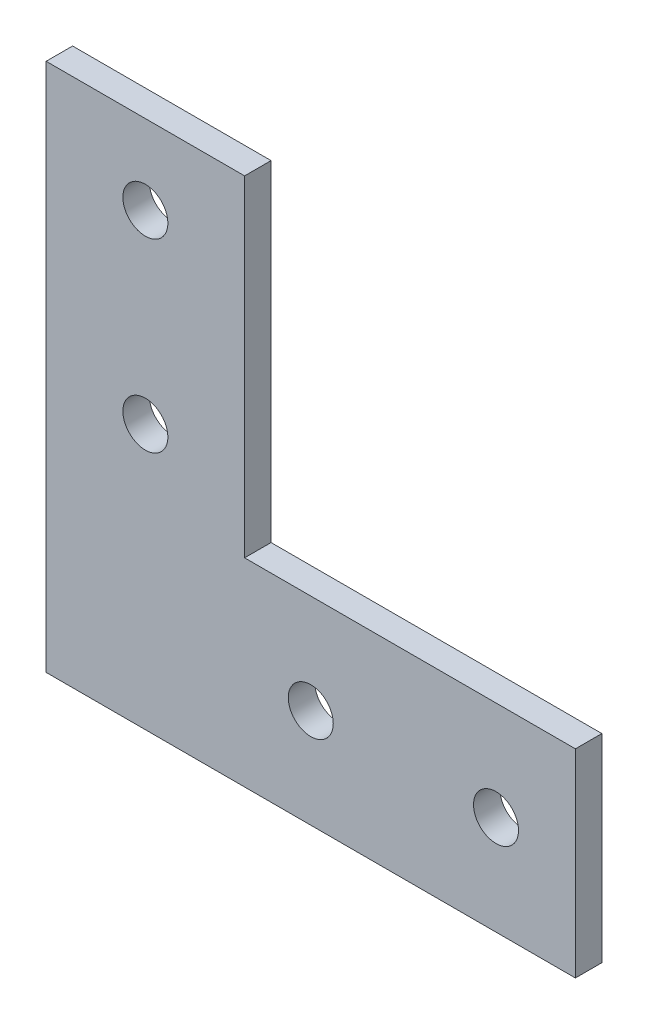
ISO-10303-21;
HEADER;
FILE_DESCRIPTION(('STEP AP214'),'2;1');
FILE_NAME('part.step','',(''),(''),'','','');
FILE_SCHEMA(('AUTOMOTIVE_DESIGN { 1 0 10303 214 1 1 1 1 }'));
ENDSEC;
DATA;
#1=APPLICATION_CONTEXT('core data for automotive mechanical design processes');
#2=APPLICATION_PROTOCOL_DEFINITION('international standard','automotive_design',2000,#1);
#3=PRODUCT_CONTEXT('',#1,'mechanical');
#4=PRODUCT('Part','Part','',(#3));
#5=PRODUCT_RELATED_PRODUCT_CATEGORY('part','',(#4));
#6=PRODUCT_DEFINITION_FORMATION('','',#4);
#7=PRODUCT_DEFINITION_CONTEXT('part definition',#1,'design');
#8=PRODUCT_DEFINITION('design','',#6,#7);
#9=PRODUCT_DEFINITION_SHAPE('','',#8);
#10=(LENGTH_UNIT() NAMED_UNIT(*) SI_UNIT(.MILLI.,.METRE.));
#11=(NAMED_UNIT(*) PLANE_ANGLE_UNIT() SI_UNIT($,.RADIAN.));
#12=(NAMED_UNIT(*) SI_UNIT($,.STERADIAN.) SOLID_ANGLE_UNIT());
#13=UNCERTAINTY_MEASURE_WITH_UNIT(LENGTH_MEASURE(1.E-05),#10,'distance_accuracy_value','');
#14=(GEOMETRIC_REPRESENTATION_CONTEXT(3) GLOBAL_UNCERTAINTY_ASSIGNED_CONTEXT((#13)) GLOBAL_UNIT_ASSIGNED_CONTEXT((#10,
#11,#12)) REPRESENTATION_CONTEXT('',''));
#15=CARTESIAN_POINT('',(0.,0.,0.));
#16=DIRECTION('',(0.,0.,1.));
#17=DIRECTION('',(1.,0.,0.));
#18=AXIS2_PLACEMENT_3D('',#15,#16,#17);
#19=CARTESIAN_POINT('',(0.,0.,2.));
#20=DIRECTION('',(0.,0.,1.));
#21=DIRECTION('',(1.,0.,0.));
#22=AXIS2_PLACEMENT_3D('',#19,#20,#21);
#23=PLANE('',#22);
#24=CARTESIAN_POINT('',(7.50000000000002,34.,2.));
#25=DIRECTION('',(0.,0.,1.));
#26=DIRECTION('',(-1.,0.,0.));
#27=AXIS2_PLACEMENT_3D('',#24,#25,#26);
#28=CIRCLE('',#27,1.7);
#29=CARTESIAN_POINT('',(5.80000000000002,34.,2.));
#30=VERTEX_POINT('',#29);
#31=EDGE_CURVE('E215',#30,#30,#28,.T.);
#32=ORIENTED_EDGE('',*,*,#31,.F.);
#33=EDGE_LOOP('',(#32));
#34=FACE_BOUND('',#33,.T.);
#35=CARTESIAN_POINT('',(20.,7.5,2.));
#36=DIRECTION('',(0.,0.,1.));
#37=DIRECTION('',(1.,0.,0.));
#38=AXIS2_PLACEMENT_3D('',#35,#36,#37);
#39=CIRCLE('',#38,1.7);
#40=CARTESIAN_POINT('',(21.7,7.5,2.));
#41=VERTEX_POINT('',#40);
#42=EDGE_CURVE('E137',#41,#41,#39,.T.);
#43=ORIENTED_EDGE('',*,*,#42,.F.);
#44=EDGE_LOOP('',(#43));
#45=FACE_BOUND('',#44,.T.);
#46=DIRECTION('',(0.,-1.,0.));
#47=VECTOR('',#46,1.);
#48=CARTESIAN_POINT('',(0.,40.,2.));
#49=LINE('',#48,#47);
#50=CARTESIAN_POINT('',(0.,40.,2.));
#51=VERTEX_POINT('',#50);
#52=CARTESIAN_POINT('',(0.,0.,2.));
#53=VERTEX_POINT('',#52);
#54=EDGE_CURVE('E149',#51,#53,#49,.T.);
#55=ORIENTED_EDGE('',*,*,#54,.T.);
#56=DIRECTION('',(1.,0.,0.));
#57=VECTOR('',#56,1.);
#58=CARTESIAN_POINT('',(0.,0.,2.));
#59=LINE('',#58,#57);
#60=CARTESIAN_POINT('',(40.,0.,2.));
#61=VERTEX_POINT('',#60);
#62=EDGE_CURVE('E97',#53,#61,#59,.T.);
#63=ORIENTED_EDGE('',*,*,#62,.T.);
#64=DIRECTION('',(0.,1.,0.));
#65=VECTOR('',#64,1.);
#66=CARTESIAN_POINT('',(40.,0.,2.));
#67=LINE('',#66,#65);
#68=CARTESIAN_POINT('',(40.,15.,2.));
#69=VERTEX_POINT('',#68);
#70=EDGE_CURVE('E110',#61,#69,#67,.T.);
#71=ORIENTED_EDGE('',*,*,#70,.T.);
#72=DIRECTION('',(-1.,0.,0.));
#73=VECTOR('',#72,1.);
#74=CARTESIAN_POINT('',(40.,15.,2.));
#75=LINE('',#74,#73);
#76=CARTESIAN_POINT('',(15.,15.,2.));
#77=VERTEX_POINT('',#76);
#78=EDGE_CURVE('E104',#69,#77,#75,.T.);
#79=ORIENTED_EDGE('',*,*,#78,.T.);
#80=DIRECTION('',(0.,1.,0.));
#81=VECTOR('',#80,1.);
#82=CARTESIAN_POINT('',(15.,15.,2.));
#83=LINE('',#82,#81);
#84=CARTESIAN_POINT('',(15.,40.,2.));
#85=VERTEX_POINT('',#84);
#86=EDGE_CURVE('E108',#77,#85,#83,.T.);
#87=ORIENTED_EDGE('',*,*,#86,.T.);
#88=DIRECTION('',(-1.,0.,0.));
#89=VECTOR('',#88,1.);
#90=CARTESIAN_POINT('',(15.,40.,2.));
#91=LINE('',#90,#89);
#92=EDGE_CURVE('E60',#85,#51,#91,.T.);
#93=ORIENTED_EDGE('',*,*,#92,.T.);
#94=EDGE_LOOP('',(#55,#63,#71,#79,#87,#93));
#95=FACE_BOUND('',#94,.T.);
#96=CARTESIAN_POINT('',(34.,7.5,2.));
#97=DIRECTION('',(0.,0.,1.));
#98=DIRECTION('',(1.,0.,0.));
#99=AXIS2_PLACEMENT_3D('',#96,#97,#98);
#100=CIRCLE('',#99,1.7);
#101=CARTESIAN_POINT('',(35.7,7.5,2.));
#102=VERTEX_POINT('',#101);
#103=EDGE_CURVE('E223',#102,#102,#100,.T.);
#104=ORIENTED_EDGE('',*,*,#103,.F.);
#105=EDGE_LOOP('',(#104));
#106=FACE_BOUND('',#105,.T.);
#107=CARTESIAN_POINT('',(7.5,20.,2.));
#108=DIRECTION('',(0.,0.,1.));
#109=DIRECTION('',(-1.,0.,0.));
#110=AXIS2_PLACEMENT_3D('',#107,#108,#109);
#111=CIRCLE('',#110,1.7);
#112=CARTESIAN_POINT('',(5.8,20.,2.));
#113=VERTEX_POINT('',#112);
#114=EDGE_CURVE('E204',#113,#113,#111,.T.);
#115=ORIENTED_EDGE('',*,*,#114,.F.);
#116=EDGE_LOOP('',(#115));
#117=FACE_BOUND('',#116,.T.);
#118=ADVANCED_FACE('F42',(#34,#45,#95,#106,#117),#23,.T.);
#119=CARTESIAN_POINT('',(0.,0.,0.));
#120=DIRECTION('',(0.,0.,1.));
#121=DIRECTION('',(1.,0.,0.));
#122=AXIS2_PLACEMENT_3D('',#119,#120,#121);
#123=PLANE('',#122);
#124=DIRECTION('',(0.,-1.,0.));
#125=VECTOR('',#124,1.);
#126=CARTESIAN_POINT('',(0.,40.,0.));
#127=LINE('',#126,#125);
#128=CARTESIAN_POINT('',(0.,40.,0.));
#129=VERTEX_POINT('',#128);
#130=CARTESIAN_POINT('',(0.,0.,0.));
#131=VERTEX_POINT('',#130);
#132=EDGE_CURVE('E132',#129,#131,#127,.T.);
#133=ORIENTED_EDGE('',*,*,#132,.F.);
#134=DIRECTION('',(-1.,0.,0.));
#135=VECTOR('',#134,1.);
#136=CARTESIAN_POINT('',(15.,40.,0.));
#137=LINE('',#136,#135);
#138=CARTESIAN_POINT('',(15.,40.,0.));
#139=VERTEX_POINT('',#138);
#140=EDGE_CURVE('E89',#139,#129,#137,.T.);
#141=ORIENTED_EDGE('',*,*,#140,.F.);
#142=DIRECTION('',(0.,1.,0.));
#143=VECTOR('',#142,1.);
#144=CARTESIAN_POINT('',(15.,15.,0.));
#145=LINE('',#144,#143);
#146=CARTESIAN_POINT('',(15.,15.,0.));
#147=VERTEX_POINT('',#146);
#148=EDGE_CURVE('E83',#147,#139,#145,.T.);
#149=ORIENTED_EDGE('',*,*,#148,.F.);
#150=DIRECTION('',(-1.,0.,0.));
#151=VECTOR('',#150,1.);
#152=CARTESIAN_POINT('',(40.,15.,0.));
#153=LINE('',#152,#151);
#154=CARTESIAN_POINT('',(40.,15.,0.));
#155=VERTEX_POINT('',#154);
#156=EDGE_CURVE('E119',#155,#147,#153,.T.);
#157=ORIENTED_EDGE('',*,*,#156,.F.);
#158=DIRECTION('',(0.,1.,0.));
#159=VECTOR('',#158,1.);
#160=CARTESIAN_POINT('',(40.,0.,0.));
#161=LINE('',#160,#159);
#162=CARTESIAN_POINT('',(40.,0.,0.));
#163=VERTEX_POINT('',#162);
#164=EDGE_CURVE('E140',#163,#155,#161,.T.);
#165=ORIENTED_EDGE('',*,*,#164,.F.);
#166=DIRECTION('',(1.,0.,0.));
#167=VECTOR('',#166,1.);
#168=CARTESIAN_POINT('',(0.,0.,0.));
#169=LINE('',#168,#167);
#170=EDGE_CURVE('E136',#131,#163,#169,.T.);
#171=ORIENTED_EDGE('',*,*,#170,.F.);
#172=EDGE_LOOP('',(#133,#141,#149,#157,#165,#171));
#173=FACE_BOUND('',#172,.T.);
#174=CARTESIAN_POINT('',(20.,7.5,0.));
#175=DIRECTION('',(0.,0.,1.));
#176=DIRECTION('',(1.,0.,0.));
#177=AXIS2_PLACEMENT_3D('',#174,#175,#176);
#178=CIRCLE('',#177,1.7);
#179=CARTESIAN_POINT('',(21.7,7.5,0.));
#180=VERTEX_POINT('',#179);
#181=EDGE_CURVE('E227',#180,#180,#178,.T.);
#182=ORIENTED_EDGE('',*,*,#181,.T.);
#183=EDGE_LOOP('',(#182));
#184=FACE_BOUND('',#183,.T.);
#185=CARTESIAN_POINT('',(34.,7.5,0.));
#186=DIRECTION('',(0.,0.,1.));
#187=DIRECTION('',(1.,0.,0.));
#188=AXIS2_PLACEMENT_3D('',#185,#186,#187);
#189=CIRCLE('',#188,1.7);
#190=CARTESIAN_POINT('',(35.7,7.5,0.));
#191=VERTEX_POINT('',#190);
#192=EDGE_CURVE('E219',#191,#191,#189,.T.);
#193=ORIENTED_EDGE('',*,*,#192,.T.);
#194=EDGE_LOOP('',(#193));
#195=FACE_BOUND('',#194,.T.);
#196=CARTESIAN_POINT('',(7.50000000000002,34.,0.));
#197=DIRECTION('',(0.,0.,1.));
#198=DIRECTION('',(-1.,0.,0.));
#199=AXIS2_PLACEMENT_3D('',#196,#197,#198);
#200=CIRCLE('',#199,1.7);
#201=CARTESIAN_POINT('',(5.80000000000002,34.,0.));
#202=VERTEX_POINT('',#201);
#203=EDGE_CURVE('E212',#202,#202,#200,.T.);
#204=ORIENTED_EDGE('',*,*,#203,.T.);
#205=EDGE_LOOP('',(#204));
#206=FACE_BOUND('',#205,.T.);
#207=CARTESIAN_POINT('',(7.5,20.,0.));
#208=DIRECTION('',(0.,0.,1.));
#209=DIRECTION('',(-1.,0.,0.));
#210=AXIS2_PLACEMENT_3D('',#207,#208,#209);
#211=CIRCLE('',#210,1.7);
#212=CARTESIAN_POINT('',(5.8,20.,0.));
#213=VERTEX_POINT('',#212);
#214=EDGE_CURVE('E207',#213,#213,#211,.T.);
#215=ORIENTED_EDGE('',*,*,#214,.T.);
#216=EDGE_LOOP('',(#215));
#217=FACE_BOUND('',#216,.T.);
#218=ADVANCED_FACE('F162',(#173,#184,#195,#206,#217),#123,.F.);
#219=CARTESIAN_POINT('',(0.,40.,2.));
#220=DIRECTION('',(1.,0.,0.));
#221=DIRECTION('',(0.,1.,0.));
#222=AXIS2_PLACEMENT_3D('',#219,#220,#221);
#223=PLANE('',#222);
#224=ORIENTED_EDGE('',*,*,#132,.T.);
#225=DIRECTION('',(0.,0.,-1.));
#226=VECTOR('',#225,1.);
#227=CARTESIAN_POINT('',(0.,0.,2.));
#228=LINE('',#227,#226);
#229=EDGE_CURVE('E11',#53,#131,#228,.T.);
#230=ORIENTED_EDGE('',*,*,#229,.F.);
#231=ORIENTED_EDGE('',*,*,#54,.F.);
#232=DIRECTION('',(0.,0.,-1.));
#233=VECTOR('',#232,1.);
#234=CARTESIAN_POINT('',(0.,40.,2.));
#235=LINE('',#234,#233);
#236=EDGE_CURVE('E128',#51,#129,#235,.T.);
#237=ORIENTED_EDGE('',*,*,#236,.T.);
#238=EDGE_LOOP('',(#224,#230,#231,#237));
#239=FACE_BOUND('',#238,.T.);
#240=ADVANCED_FACE('F44',(#239),#223,.F.);
#241=CARTESIAN_POINT('',(0.,0.,2.));
#242=DIRECTION('',(0.,1.,0.));
#243=DIRECTION('',(0.,0.,1.));
#244=AXIS2_PLACEMENT_3D('',#241,#242,#243);
#245=PLANE('',#244);
#246=ORIENTED_EDGE('',*,*,#170,.T.);
#247=DIRECTION('',(0.,0.,-1.));
#248=VECTOR('',#247,1.);
#249=CARTESIAN_POINT('',(40.,0.,2.));
#250=LINE('',#249,#248);
#251=EDGE_CURVE('E52',#61,#163,#250,.T.);
#252=ORIENTED_EDGE('',*,*,#251,.F.);
#253=ORIENTED_EDGE('',*,*,#62,.F.);
#254=ORIENTED_EDGE('',*,*,#229,.T.);
#255=EDGE_LOOP('',(#246,#252,#253,#254));
#256=FACE_BOUND('',#255,.T.);
#257=ADVANCED_FACE('F295',(#256),#245,.F.);
#258=CARTESIAN_POINT('',(40.,0.,2.));
#259=DIRECTION('',(-1.,0.,0.));
#260=DIRECTION('',(0.,-1.,0.));
#261=AXIS2_PLACEMENT_3D('',#258,#259,#260);
#262=PLANE('',#261);
#263=ORIENTED_EDGE('',*,*,#164,.T.);
#264=DIRECTION('',(0.,0.,-1.));
#265=VECTOR('',#264,1.);
#266=CARTESIAN_POINT('',(40.,15.,2.));
#267=LINE('',#266,#265);
#268=EDGE_CURVE('E121',#69,#155,#267,.T.);
#269=ORIENTED_EDGE('',*,*,#268,.F.);
#270=ORIENTED_EDGE('',*,*,#70,.F.);
#271=ORIENTED_EDGE('',*,*,#251,.T.);
#272=EDGE_LOOP('',(#263,#269,#270,#271));
#273=FACE_BOUND('',#272,.T.);
#274=ADVANCED_FACE('F159',(#273),#262,.F.);
#275=CARTESIAN_POINT('',(40.,15.,2.));
#276=DIRECTION('',(0.,-1.,0.));
#277=DIRECTION('',(1.,0.,0.));
#278=AXIS2_PLACEMENT_3D('',#275,#276,#277);
#279=PLANE('',#278);
#280=ORIENTED_EDGE('',*,*,#156,.T.);
#281=DIRECTION('',(0.,0.,-1.));
#282=VECTOR('',#281,1.);
#283=CARTESIAN_POINT('',(15.,15.,2.));
#284=LINE('',#283,#282);
#285=EDGE_CURVE('E116',#77,#147,#284,.T.);
#286=ORIENTED_EDGE('',*,*,#285,.F.);
#287=ORIENTED_EDGE('',*,*,#78,.F.);
#288=ORIENTED_EDGE('',*,*,#268,.T.);
#289=EDGE_LOOP('',(#280,#286,#287,#288));
#290=FACE_BOUND('',#289,.T.);
#291=ADVANCED_FACE('F117',(#290),#279,.F.);
#292=CARTESIAN_POINT('',(15.,15.,2.));
#293=DIRECTION('',(-1.,0.,0.));
#294=DIRECTION('',(0.,0.,1.));
#295=AXIS2_PLACEMENT_3D('',#292,#293,#294);
#296=PLANE('',#295);
#297=ORIENTED_EDGE('',*,*,#148,.T.);
#298=DIRECTION('',(0.,0.,-1.));
#299=VECTOR('',#298,1.);
#300=CARTESIAN_POINT('',(15.,40.,2.));
#301=LINE('',#300,#299);
#302=EDGE_CURVE('E122',#85,#139,#301,.T.);
#303=ORIENTED_EDGE('',*,*,#302,.F.);
#304=ORIENTED_EDGE('',*,*,#86,.F.);
#305=ORIENTED_EDGE('',*,*,#285,.T.);
#306=EDGE_LOOP('',(#297,#303,#304,#305));
#307=FACE_BOUND('',#306,.T.);
#308=ADVANCED_FACE('F124',(#307),#296,.F.);
#309=CARTESIAN_POINT('',(15.,40.,2.));
#310=DIRECTION('',(0.,-1.,0.));
#311=DIRECTION('',(0.,0.,-1.));
#312=AXIS2_PLACEMENT_3D('',#309,#310,#311);
#313=PLANE('',#312);
#314=ORIENTED_EDGE('',*,*,#140,.T.);
#315=ORIENTED_EDGE('',*,*,#236,.F.);
#316=ORIENTED_EDGE('',*,*,#92,.F.);
#317=ORIENTED_EDGE('',*,*,#302,.T.);
#318=EDGE_LOOP('',(#314,#315,#316,#317));
#319=FACE_BOUND('',#318,.T.);
#320=ADVANCED_FACE('F167',(#319),#313,.F.);
#321=CARTESIAN_POINT('',(20.,7.5,2.));
#322=DIRECTION('',(0.,0.,-1.));
#323=DIRECTION('',(-1.,0.,0.));
#324=AXIS2_PLACEMENT_3D('',#321,#322,#323);
#325=CYLINDRICAL_SURFACE('',#324,1.7);
#326=ORIENTED_EDGE('',*,*,#42,.T.);
#327=EDGE_LOOP('',(#326));
#328=FACE_BOUND('',#327,.T.);
#329=ORIENTED_EDGE('',*,*,#181,.F.);
#330=EDGE_LOOP('',(#329));
#331=FACE_BOUND('',#330,.T.);
#332=ADVANCED_FACE('F169',(#328,#331),#325,.F.);
#333=CARTESIAN_POINT('',(34.,7.5,2.));
#334=DIRECTION('',(0.,0.,-1.));
#335=DIRECTION('',(-1.,0.,0.));
#336=AXIS2_PLACEMENT_3D('',#333,#334,#335);
#337=CYLINDRICAL_SURFACE('',#336,1.7);
#338=ORIENTED_EDGE('',*,*,#103,.T.);
#339=EDGE_LOOP('',(#338));
#340=FACE_BOUND('',#339,.T.);
#341=ORIENTED_EDGE('',*,*,#192,.F.);
#342=EDGE_LOOP('',(#341));
#343=FACE_BOUND('',#342,.T.);
#344=ADVANCED_FACE('F175',(#340,#343),#337,.F.);
#345=CARTESIAN_POINT('',(7.50000000000002,34.,2.));
#346=DIRECTION('',(0.,0.,-1.));
#347=DIRECTION('',(-1.,0.,0.));
#348=AXIS2_PLACEMENT_3D('',#345,#346,#347);
#349=CYLINDRICAL_SURFACE('',#348,1.7);
#350=ORIENTED_EDGE('',*,*,#31,.T.);
#351=EDGE_LOOP('',(#350));
#352=FACE_BOUND('',#351,.T.);
#353=ORIENTED_EDGE('',*,*,#203,.F.);
#354=EDGE_LOOP('',(#353));
#355=FACE_BOUND('',#354,.T.);
#356=ADVANCED_FACE('F191',(#352,#355),#349,.F.);
#357=CARTESIAN_POINT('',(7.5,20.,2.));
#358=DIRECTION('',(0.,0.,-1.));
#359=DIRECTION('',(-1.,0.,0.));
#360=AXIS2_PLACEMENT_3D('',#357,#358,#359);
#361=CYLINDRICAL_SURFACE('',#360,1.7);
#362=ORIENTED_EDGE('',*,*,#114,.T.);
#363=EDGE_LOOP('',(#362));
#364=FACE_BOUND('',#363,.T.);
#365=ORIENTED_EDGE('',*,*,#214,.F.);
#366=EDGE_LOOP('',(#365));
#367=FACE_BOUND('',#366,.T.);
#368=ADVANCED_FACE('F195',(#364,#367),#361,.F.);
#369=CLOSED_SHELL('',(#118,#218,#240,#257,#274,#291,#308,#320,#332,#344,#356,#368));
#370=MANIFOLD_SOLID_BREP('B2',#369);
#371=ADVANCED_BREP_SHAPE_REPRESENTATION('',(#18,#370),#14);
#372=SHAPE_DEFINITION_REPRESENTATION(#9,#371);
ENDSEC;
END-ISO-10303-21;
